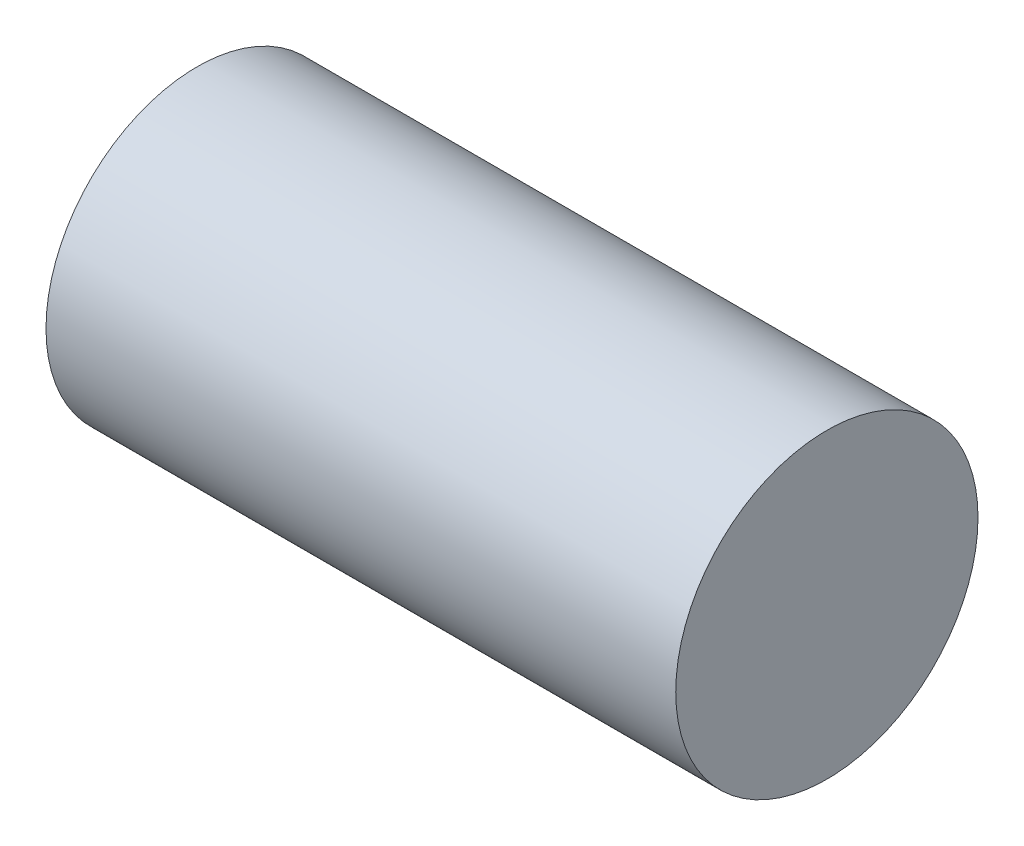
ISO-10303-21;
HEADER;
FILE_DESCRIPTION(('STEP AP214'),'2;1');
FILE_NAME('part.step','',(''),(''),'','','');
FILE_SCHEMA(('AUTOMOTIVE_DESIGN { 1 0 10303 214 1 1 1 1 }'));
ENDSEC;
DATA;
#1=APPLICATION_CONTEXT('core data for automotive mechanical design processes');
#2=APPLICATION_PROTOCOL_DEFINITION('international standard','automotive_design',2000,#1);
#3=PRODUCT_CONTEXT('',#1,'mechanical');
#4=PRODUCT('Part','Part','',(#3));
#5=PRODUCT_RELATED_PRODUCT_CATEGORY('part','',(#4));
#6=PRODUCT_DEFINITION_FORMATION('','',#4);
#7=PRODUCT_DEFINITION_CONTEXT('part definition',#1,'design');
#8=PRODUCT_DEFINITION('design','',#6,#7);
#9=PRODUCT_DEFINITION_SHAPE('','',#8);
#10=(LENGTH_UNIT() NAMED_UNIT(*) SI_UNIT(.MILLI.,.METRE.));
#11=(NAMED_UNIT(*) PLANE_ANGLE_UNIT() SI_UNIT($,.RADIAN.));
#12=(NAMED_UNIT(*) SI_UNIT($,.STERADIAN.) SOLID_ANGLE_UNIT());
#13=UNCERTAINTY_MEASURE_WITH_UNIT(LENGTH_MEASURE(1.E-05),#10,'distance_accuracy_value','');
#14=(GEOMETRIC_REPRESENTATION_CONTEXT(3) GLOBAL_UNCERTAINTY_ASSIGNED_CONTEXT((#13)) GLOBAL_UNIT_ASSIGNED_CONTEXT((#10,
#11,#12)) REPRESENTATION_CONTEXT('',''));
#15=CARTESIAN_POINT('',(0.,0.,0.));
#16=DIRECTION('',(0.,0.,1.));
#17=DIRECTION('',(1.,0.,0.));
#18=AXIS2_PLACEMENT_3D('',#15,#16,#17);
#19=CARTESIAN_POINT('',(0.,0.,0.));
#20=DIRECTION('',(-1.,0.,0.));
#21=DIRECTION('',(0.,0.,1.));
#22=AXIS2_PLACEMENT_3D('',#19,#20,#21);
#23=CYLINDRICAL_SURFACE('',#22,2.4);
#24=CARTESIAN_POINT('',(10.,0.,0.));
#25=DIRECTION('',(-1.,0.,0.));
#26=DIRECTION('',(0.,0.,1.));
#27=AXIS2_PLACEMENT_3D('',#24,#25,#26);
#28=CIRCLE('',#27,2.4);
#29=CARTESIAN_POINT('',(10.,0.,2.4));
#30=VERTEX_POINT('',#29);
#31=EDGE_CURVE('E44',#30,#30,#28,.T.);
#32=ORIENTED_EDGE('',*,*,#31,.T.);
#33=EDGE_LOOP('',(#32));
#34=FACE_BOUND('',#33,.T.);
#35=CARTESIAN_POINT('',(0.,0.,0.));
#36=DIRECTION('',(-1.,0.,0.));
#37=DIRECTION('',(0.,0.,1.));
#38=AXIS2_PLACEMENT_3D('',#35,#36,#37);
#39=CIRCLE('',#38,2.4);
#40=CARTESIAN_POINT('',(0.,0.,2.4));
#41=VERTEX_POINT('',#40);
#42=EDGE_CURVE('E10',#41,#41,#39,.T.);
#43=ORIENTED_EDGE('',*,*,#42,.F.);
#44=EDGE_LOOP('',(#43));
#45=FACE_BOUND('',#44,.T.);
#46=ADVANCED_FACE('F37',(#34,#45),#23,.T.);
#47=CARTESIAN_POINT('',(0.,-2.4,0.));
#48=DIRECTION('',(1.,0.,0.));
#49=DIRECTION('',(0.,0.,-1.));
#50=AXIS2_PLACEMENT_3D('',#47,#48,#49);
#51=PLANE('',#50);
#52=ORIENTED_EDGE('',*,*,#42,.T.);
#53=EDGE_LOOP('',(#52));
#54=FACE_BOUND('',#53,.T.);
#55=ADVANCED_FACE('F55',(#54),#51,.F.);
#56=CARTESIAN_POINT('',(10.,0.,0.));
#57=DIRECTION('',(-1.,0.,0.));
#58=DIRECTION('',(0.,0.,1.));
#59=AXIS2_PLACEMENT_3D('',#56,#57,#58);
#60=PLANE('',#59);
#61=ORIENTED_EDGE('',*,*,#31,.F.);
#62=EDGE_LOOP('',(#61));
#63=FACE_BOUND('',#62,.T.);
#64=ADVANCED_FACE('F53',(#63),#60,.F.);
#65=CLOSED_SHELL('',(#46,#55,#64));
#66=MANIFOLD_SOLID_BREP('B2',#65);
#67=ADVANCED_BREP_SHAPE_REPRESENTATION('',(#18,#66),#14);
#68=SHAPE_DEFINITION_REPRESENTATION(#9,#67);
ENDSEC;
END-ISO-10303-21;
